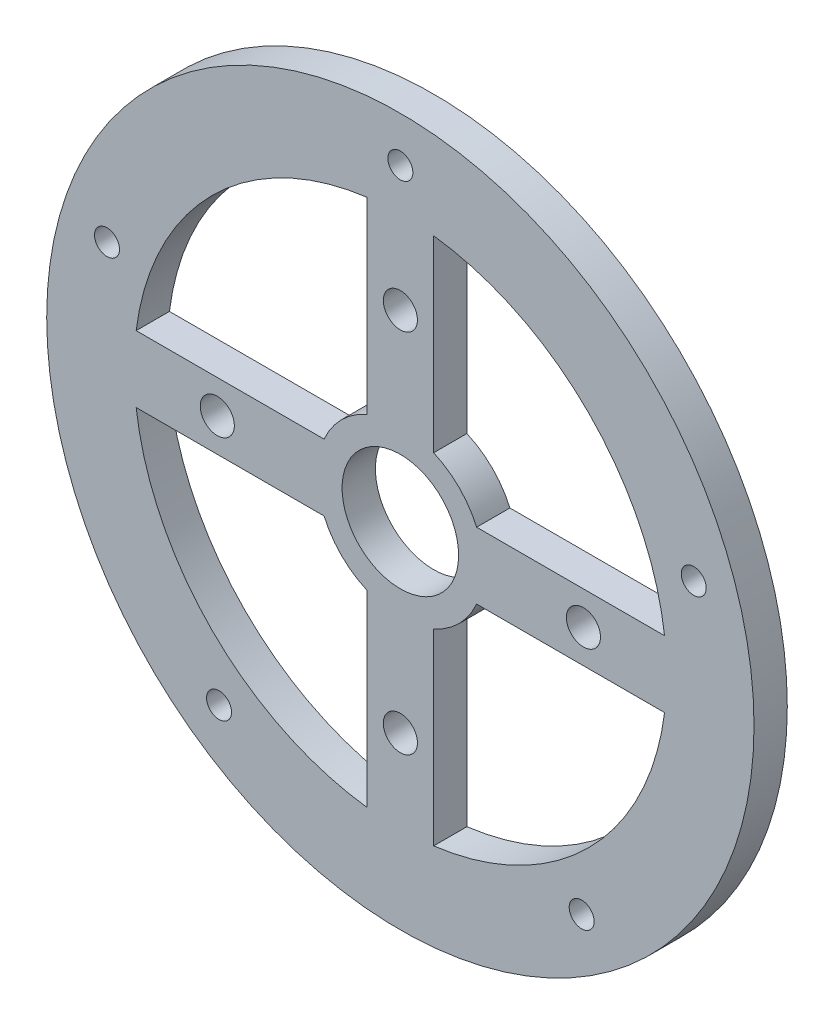
ISO-10303-21;
HEADER;
FILE_DESCRIPTION(('STEP AP214'),'2;1');
FILE_NAME('part.step','',(''),(''),'','','');
FILE_SCHEMA(('AUTOMOTIVE_DESIGN { 1 0 10303 214 1 1 1 1 }'));
ENDSEC;
DATA;
#1=APPLICATION_CONTEXT('core data for automotive mechanical design processes');
#2=APPLICATION_PROTOCOL_DEFINITION('international standard','automotive_design',2000,#1);
#3=PRODUCT_CONTEXT('',#1,'mechanical');
#4=PRODUCT('Part','Part','',(#3));
#5=PRODUCT_RELATED_PRODUCT_CATEGORY('part','',(#4));
#6=PRODUCT_DEFINITION_FORMATION('','',#4);
#7=PRODUCT_DEFINITION_CONTEXT('part definition',#1,'design');
#8=PRODUCT_DEFINITION('design','',#6,#7);
#9=PRODUCT_DEFINITION_SHAPE('','',#8);
#10=(LENGTH_UNIT() NAMED_UNIT(*) SI_UNIT(.MILLI.,.METRE.));
#11=(NAMED_UNIT(*) PLANE_ANGLE_UNIT() SI_UNIT($,.RADIAN.));
#12=(NAMED_UNIT(*) SI_UNIT($,.STERADIAN.) SOLID_ANGLE_UNIT());
#13=UNCERTAINTY_MEASURE_WITH_UNIT(LENGTH_MEASURE(1.E-05),#10,'distance_accuracy_value','');
#14=(GEOMETRIC_REPRESENTATION_CONTEXT(3) GLOBAL_UNCERTAINTY_ASSIGNED_CONTEXT((#13)) GLOBAL_UNIT_ASSIGNED_CONTEXT((#10,
#11,#12)) REPRESENTATION_CONTEXT('',''));
#15=CARTESIAN_POINT('',(0.,0.,0.));
#16=DIRECTION('',(0.,0.,1.));
#17=DIRECTION('',(1.,0.,0.));
#18=AXIS2_PLACEMENT_3D('',#15,#16,#17);
#19=CARTESIAN_POINT('',(0.,0.,4.));
#20=DIRECTION('',(0.,0.,-1.));
#21=DIRECTION('',(-1.,0.,0.));
#22=AXIS2_PLACEMENT_3D('',#19,#20,#21);
#23=CYLINDRICAL_SURFACE('',#22,32.);
#24=DIRECTION('',(0.,0.,1.));
#25=VECTOR('',#24,1.);
#26=CARTESIAN_POINT('',(-4.,-31.7490157327751,0.));
#27=LINE('',#26,#25);
#28=CARTESIAN_POINT('',(-4.,-31.7490157327751,0.));
#29=VERTEX_POINT('',#28);
#30=CARTESIAN_POINT('',(-4.,-31.7490157327751,4.));
#31=VERTEX_POINT('',#30);
#32=EDGE_CURVE('E261',#29,#31,#27,.T.);
#33=ORIENTED_EDGE('',*,*,#32,.F.);
#34=CARTESIAN_POINT('',(0.,0.,0.));
#35=DIRECTION('',(0.,0.,1.));
#36=DIRECTION('',(1.,0.,0.));
#37=AXIS2_PLACEMENT_3D('',#34,#35,#36);
#38=CIRCLE('',#37,32.);
#39=CARTESIAN_POINT('',(-31.7490157327751,-4.,0.));
#40=VERTEX_POINT('',#39);
#41=EDGE_CURVE('E335',#40,#29,#38,.T.);
#42=ORIENTED_EDGE('',*,*,#41,.F.);
#43=DIRECTION('',(0.,0.,1.));
#44=VECTOR('',#43,1.);
#45=CARTESIAN_POINT('',(-31.7490157327751,-4.,0.));
#46=LINE('',#45,#44);
#47=CARTESIAN_POINT('',(-31.7490157327751,-4.,4.));
#48=VERTEX_POINT('',#47);
#49=EDGE_CURVE('E269',#40,#48,#46,.T.);
#50=ORIENTED_EDGE('',*,*,#49,.T.);
#51=CARTESIAN_POINT('',(0.,0.,4.));
#52=DIRECTION('',(0.,0.,1.));
#53=DIRECTION('',(1.,0.,0.));
#54=AXIS2_PLACEMENT_3D('',#51,#52,#53);
#55=CIRCLE('',#54,32.);
#56=EDGE_CURVE('E333',#48,#31,#55,.T.);
#57=ORIENTED_EDGE('',*,*,#56,.T.);
#58=EDGE_LOOP('',(#33,#42,#50,#57));
#59=FACE_BOUND('',#58,.T.);
#60=ADVANCED_FACE('F33',(#59),#23,.F.);
#61=DIRECTION('',(0.,0.,1.));
#62=VECTOR('',#61,1.);
#63=CARTESIAN_POINT('',(-31.7490157327751,4.,0.));
#64=LINE('',#63,#62);
#65=CARTESIAN_POINT('',(-31.7490157327751,4.,0.));
#66=VERTEX_POINT('',#65);
#67=CARTESIAN_POINT('',(-31.7490157327751,4.,4.));
#68=VERTEX_POINT('',#67);
#69=EDGE_CURVE('E272',#66,#68,#64,.T.);
#70=ORIENTED_EDGE('',*,*,#69,.F.);
#71=CARTESIAN_POINT('',(-4.,31.7490157327751,0.));
#72=VERTEX_POINT('',#71);
#73=EDGE_CURVE('E330',#72,#66,#38,.T.);
#74=ORIENTED_EDGE('',*,*,#73,.F.);
#75=DIRECTION('',(0.,0.,1.));
#76=VECTOR('',#75,1.);
#77=CARTESIAN_POINT('',(-4.,31.7490157327751,0.));
#78=LINE('',#77,#76);
#79=CARTESIAN_POINT('',(-4.,31.7490157327751,4.));
#80=VERTEX_POINT('',#79);
#81=EDGE_CURVE('E279',#72,#80,#78,.T.);
#82=ORIENTED_EDGE('',*,*,#81,.T.);
#83=EDGE_CURVE('E326',#80,#68,#55,.T.);
#84=ORIENTED_EDGE('',*,*,#83,.T.);
#85=EDGE_LOOP('',(#70,#74,#82,#84));
#86=FACE_BOUND('',#85,.T.);
#87=ADVANCED_FACE('F355',(#86),#23,.F.);
#88=DIRECTION('',(0.,0.,1.));
#89=VECTOR('',#88,1.);
#90=CARTESIAN_POINT('',(4.,31.7490157327751,0.));
#91=LINE('',#90,#89);
#92=CARTESIAN_POINT('',(4.,31.7490157327751,0.));
#93=VERTEX_POINT('',#92);
#94=CARTESIAN_POINT('',(4.,31.7490157327751,4.));
#95=VERTEX_POINT('',#94);
#96=EDGE_CURVE('E282',#93,#95,#91,.T.);
#97=ORIENTED_EDGE('',*,*,#96,.F.);
#98=CARTESIAN_POINT('',(31.7490157327751,4.,0.));
#99=VERTEX_POINT('',#98);
#100=EDGE_CURVE('E328',#99,#93,#38,.T.);
#101=ORIENTED_EDGE('',*,*,#100,.F.);
#102=DIRECTION('',(0.,0.,1.));
#103=VECTOR('',#102,1.);
#104=CARTESIAN_POINT('',(31.7490157327751,4.,0.));
#105=LINE('',#104,#103);
#106=CARTESIAN_POINT('',(31.7490157327751,4.,4.));
#107=VERTEX_POINT('',#106);
#108=EDGE_CURVE('E289',#99,#107,#105,.T.);
#109=ORIENTED_EDGE('',*,*,#108,.T.);
#110=EDGE_CURVE('E324',#107,#95,#55,.T.);
#111=ORIENTED_EDGE('',*,*,#110,.T.);
#112=EDGE_LOOP('',(#97,#101,#109,#111));
#113=FACE_BOUND('',#112,.T.);
#114=ADVANCED_FACE('F389',(#113),#23,.F.);
#115=CARTESIAN_POINT('',(0.,0.,4.));
#116=DIRECTION('',(0.,0.,1.));
#117=DIRECTION('',(1.,0.,0.));
#118=AXIS2_PLACEMENT_3D('',#115,#116,#117);
#119=PLANE('',#118);
#120=DIRECTION('',(0.,1.,0.));
#121=VECTOR('',#120,1.);
#122=CARTESIAN_POINT('',(4.,0.,4.));
#123=LINE('',#122,#121);
#124=CARTESIAN_POINT('',(4.,9.16515138991168,4.));
#125=VERTEX_POINT('',#124);
#126=EDGE_CURVE('E226',#125,#95,#123,.T.);
#127=ORIENTED_EDGE('',*,*,#126,.T.);
#128=ORIENTED_EDGE('',*,*,#110,.F.);
#129=DIRECTION('',(1.,0.,0.));
#130=VECTOR('',#129,1.);
#131=CARTESIAN_POINT('',(0.,4.,4.));
#132=LINE('',#131,#130);
#133=CARTESIAN_POINT('',(9.16515138991168,4.,4.));
#134=VERTEX_POINT('',#133);
#135=EDGE_CURVE('E220',#134,#107,#132,.T.);
#136=ORIENTED_EDGE('',*,*,#135,.F.);
#137=CARTESIAN_POINT('',(0.,0.,4.));
#138=DIRECTION('',(0.,0.,1.));
#139=DIRECTION('',(1.,0.,0.));
#140=AXIS2_PLACEMENT_3D('',#137,#138,#139);
#141=CIRCLE('',#140,10.);
#142=EDGE_CURVE('E223',#134,#125,#141,.T.);
#143=ORIENTED_EDGE('',*,*,#142,.T.);
#144=EDGE_LOOP('',(#127,#128,#136,#143));
#145=FACE_BOUND('',#144,.T.);
#146=DIRECTION('',(-1.,0.,0.));
#147=VECTOR('',#146,1.);
#148=CARTESIAN_POINT('',(0.,4.,4.));
#149=LINE('',#148,#147);
#150=CARTESIAN_POINT('',(-9.16515138991168,4.,4.));
#151=VERTEX_POINT('',#150);
#152=EDGE_CURVE('E235',#151,#68,#149,.T.);
#153=ORIENTED_EDGE('',*,*,#152,.T.);
#154=ORIENTED_EDGE('',*,*,#83,.F.);
#155=DIRECTION('',(0.,1.,0.));
#156=VECTOR('',#155,1.);
#157=CARTESIAN_POINT('',(-4.,0.,4.));
#158=LINE('',#157,#156);
#159=CARTESIAN_POINT('',(-4.,9.16515138991168,4.));
#160=VERTEX_POINT('',#159);
#161=EDGE_CURVE('E229',#160,#80,#158,.T.);
#162=ORIENTED_EDGE('',*,*,#161,.F.);
#163=CARTESIAN_POINT('',(0.,0.,4.));
#164=DIRECTION('',(0.,0.,1.));
#165=DIRECTION('',(1.,0.,0.));
#166=AXIS2_PLACEMENT_3D('',#163,#164,#165);
#167=CIRCLE('',#166,10.);
#168=EDGE_CURVE('E232',#160,#151,#167,.T.);
#169=ORIENTED_EDGE('',*,*,#168,.T.);
#170=EDGE_LOOP('',(#153,#154,#162,#169));
#171=FACE_BOUND('',#170,.T.);
#172=DIRECTION('',(0.,-1.,0.));
#173=VECTOR('',#172,1.);
#174=CARTESIAN_POINT('',(-4.,0.,4.));
#175=LINE('',#174,#173);
#176=CARTESIAN_POINT('',(-4.,-9.16515138991168,4.));
#177=VERTEX_POINT('',#176);
#178=EDGE_CURVE('E244',#177,#31,#175,.T.);
#179=ORIENTED_EDGE('',*,*,#178,.T.);
#180=ORIENTED_EDGE('',*,*,#56,.F.);
#181=DIRECTION('',(-1.,0.,0.));
#182=VECTOR('',#181,1.);
#183=CARTESIAN_POINT('',(0.,-4.,4.));
#184=LINE('',#183,#182);
#185=CARTESIAN_POINT('',(-9.16515138991168,-4.,4.));
#186=VERTEX_POINT('',#185);
#187=EDGE_CURVE('E238',#186,#48,#184,.T.);
#188=ORIENTED_EDGE('',*,*,#187,.F.);
#189=CARTESIAN_POINT('',(0.,0.,4.));
#190=DIRECTION('',(0.,0.,1.));
#191=DIRECTION('',(1.,0.,0.));
#192=AXIS2_PLACEMENT_3D('',#189,#190,#191);
#193=CIRCLE('',#192,10.);
#194=EDGE_CURVE('E241',#186,#177,#193,.T.);
#195=ORIENTED_EDGE('',*,*,#194,.T.);
#196=EDGE_LOOP('',(#179,#180,#188,#195));
#197=FACE_BOUND('',#196,.T.);
#198=CARTESIAN_POINT('',(-21.7872378496499,-29.9875602732682,4.));
#199=DIRECTION('',(0.,0.,1.));
#200=DIRECTION('',(1.,0.,0.));
#201=AXIS2_PLACEMENT_3D('',#198,#199,#200);
#202=CIRCLE('',#201,1.5000000000033);
#203=CARTESIAN_POINT('',(-20.2872378496466,-29.9875602732682,4.));
#204=VERTEX_POINT('',#203);
#205=EDGE_CURVE('E301',#204,#204,#202,.T.);
#206=ORIENTED_EDGE('',*,*,#205,.F.);
#207=EDGE_LOOP('',(#206));
#208=FACE_BOUND('',#207,.T.);
#209=CARTESIAN_POINT('',(35.2524913617173,11.4542287847035,4.));
#210=DIRECTION('',(0.,0.,1.));
#211=DIRECTION('',(1.,0.,0.));
#212=AXIS2_PLACEMENT_3D('',#209,#210,#211);
#213=CIRCLE('',#212,1.50000000000071);
#214=CARTESIAN_POINT('',(36.752491361718,11.4542287847035,4.));
#215=VERTEX_POINT('',#214);
#216=EDGE_CURVE('E313',#215,#215,#213,.T.);
#217=ORIENTED_EDGE('',*,*,#216,.F.);
#218=EDGE_LOOP('',(#217));
#219=FACE_BOUND('',#218,.T.);
#220=CARTESIAN_POINT('',(4.,-31.7490157327751,4.));
#221=VERTEX_POINT('',#220);
#222=CARTESIAN_POINT('',(31.7490157327751,-4.,4.));
#223=VERTEX_POINT('',#222);
#224=EDGE_CURVE('E327',#221,#223,#55,.T.);
#225=ORIENTED_EDGE('',*,*,#224,.F.);
#226=DIRECTION('',(0.,-1.,0.));
#227=VECTOR('',#226,1.);
#228=CARTESIAN_POINT('',(4.,0.,4.));
#229=LINE('',#228,#227);
#230=CARTESIAN_POINT('',(4.,-9.16515138991168,4.));
#231=VERTEX_POINT('',#230);
#232=EDGE_CURVE('E214',#231,#221,#229,.T.);
#233=ORIENTED_EDGE('',*,*,#232,.F.);
#234=CARTESIAN_POINT('',(0.,0.,4.));
#235=DIRECTION('',(0.,0.,1.));
#236=DIRECTION('',(1.,0.,0.));
#237=AXIS2_PLACEMENT_3D('',#234,#235,#236);
#238=CIRCLE('',#237,10.);
#239=CARTESIAN_POINT('',(9.16515138991168,-4.,4.));
#240=VERTEX_POINT('',#239);
#241=EDGE_CURVE('E151',#231,#240,#238,.T.);
#242=ORIENTED_EDGE('',*,*,#241,.T.);
#243=DIRECTION('',(1.,0.,0.));
#244=VECTOR('',#243,1.);
#245=CARTESIAN_POINT('',(0.,-4.,4.));
#246=LINE('',#245,#244);
#247=EDGE_CURVE('E217',#240,#223,#246,.T.);
#248=ORIENTED_EDGE('',*,*,#247,.T.);
#249=EDGE_LOOP('',(#225,#233,#242,#248));
#250=FACE_BOUND('',#249,.T.);
#251=CARTESIAN_POINT('',(0.,0.,4.));
#252=DIRECTION('',(0.,0.,1.));
#253=DIRECTION('',(1.,0.,0.));
#254=AXIS2_PLACEMENT_3D('',#251,#252,#253);
#255=CIRCLE('',#254,42.5);
#256=CARTESIAN_POINT('',(42.5,0.,4.));
#257=VERTEX_POINT('',#256);
#258=EDGE_CURVE('E11',#257,#257,#255,.T.);
#259=ORIENTED_EDGE('',*,*,#258,.T.);
#260=EDGE_LOOP('',(#259));
#261=FACE_BOUND('',#260,.T.);
#262=CARTESIAN_POINT('',(0.,37.0666629771305,4.));
#263=DIRECTION('',(0.,0.,1.));
#264=DIRECTION('',(1.,0.,0.));
#265=AXIS2_PLACEMENT_3D('',#262,#263,#264);
#266=CIRCLE('',#265,1.5);
#267=CARTESIAN_POINT('',(1.5,37.0666629771305,4.));
#268=VERTEX_POINT('',#267);
#269=EDGE_CURVE('E319',#268,#268,#266,.T.);
#270=ORIENTED_EDGE('',*,*,#269,.F.);
#271=EDGE_LOOP('',(#270));
#272=FACE_BOUND('',#271,.T.);
#273=CARTESIAN_POINT('',(21.7872378496555,-29.9875602732663,4.));
#274=DIRECTION('',(0.,0.,1.));
#275=DIRECTION('',(1.,0.,0.));
#276=AXIS2_PLACEMENT_3D('',#273,#274,#275);
#277=CIRCLE('',#276,1.50000000000267);
#278=CARTESIAN_POINT('',(23.2872378496582,-29.9875602732663,4.));
#279=VERTEX_POINT('',#278);
#280=EDGE_CURVE('E307',#279,#279,#277,.T.);
#281=ORIENTED_EDGE('',*,*,#280,.F.);
#282=EDGE_LOOP('',(#281));
#283=FACE_BOUND('',#282,.T.);
#284=CARTESIAN_POINT('',(-35.2524913617152,11.4542287847005,4.));
#285=DIRECTION('',(0.,0.,1.));
#286=DIRECTION('',(1.,0.,0.));
#287=AXIS2_PLACEMENT_3D('',#284,#285,#286);
#288=CIRCLE('',#287,1.50000000000189);
#289=CARTESIAN_POINT('',(-33.7524913617133,11.4542287847005,4.));
#290=VERTEX_POINT('',#289);
#291=EDGE_CURVE('E295',#290,#290,#288,.T.);
#292=ORIENTED_EDGE('',*,*,#291,.F.);
#293=EDGE_LOOP('',(#292));
#294=FACE_BOUND('',#293,.T.);
#295=CARTESIAN_POINT('',(0.,-22.,4.));
#296=DIRECTION('',(0.,0.,1.));
#297=DIRECTION('',(1.,0.,0.));
#298=AXIS2_PLACEMENT_3D('',#295,#296,#297);
#299=CIRCLE('',#298,2.05000000000015);
#300=CARTESIAN_POINT('',(2.05000000000015,-22.,4.));
#301=VERTEX_POINT('',#300);
#302=EDGE_CURVE('E247',#301,#301,#299,.T.);
#303=ORIENTED_EDGE('',*,*,#302,.F.);
#304=EDGE_LOOP('',(#303));
#305=FACE_BOUND('',#304,.T.);
#306=CARTESIAN_POINT('',(0.,0.,4.));
#307=DIRECTION('',(0.,0.,1.));
#308=DIRECTION('',(1.,0.,0.));
#309=AXIS2_PLACEMENT_3D('',#306,#307,#308);
#310=CIRCLE('',#309,7.);
#311=CARTESIAN_POINT('',(7.,0.,4.));
#312=VERTEX_POINT('',#311);
#313=EDGE_CURVE('E250',#312,#312,#310,.T.);
#314=ORIENTED_EDGE('',*,*,#313,.F.);
#315=EDGE_LOOP('',(#314));
#316=FACE_BOUND('',#315,.T.);
#317=CARTESIAN_POINT('',(-22.,0.,4.));
#318=DIRECTION('',(0.,0.,1.));
#319=DIRECTION('',(1.,0.,0.));
#320=AXIS2_PLACEMENT_3D('',#317,#318,#319);
#321=CIRCLE('',#320,2.05000000000022);
#322=CARTESIAN_POINT('',(-19.9499999999998,0.,4.));
#323=VERTEX_POINT('',#322);
#324=EDGE_CURVE('E253',#323,#323,#321,.T.);
#325=ORIENTED_EDGE('',*,*,#324,.F.);
#326=EDGE_LOOP('',(#325));
#327=FACE_BOUND('',#326,.T.);
#328=CARTESIAN_POINT('',(22.,0.,4.));
#329=DIRECTION('',(0.,0.,1.));
#330=DIRECTION('',(1.,0.,0.));
#331=AXIS2_PLACEMENT_3D('',#328,#329,#330);
#332=CIRCLE('',#331,2.05000000000007);
#333=CARTESIAN_POINT('',(24.0500000000001,0.,4.));
#334=VERTEX_POINT('',#333);
#335=EDGE_CURVE('E256',#334,#334,#332,.T.);
#336=ORIENTED_EDGE('',*,*,#335,.F.);
#337=EDGE_LOOP('',(#336));
#338=FACE_BOUND('',#337,.T.);
#339=CARTESIAN_POINT('',(0.,22.,4.));
#340=DIRECTION('',(0.,0.,1.));
#341=DIRECTION('',(1.,0.,0.));
#342=AXIS2_PLACEMENT_3D('',#339,#340,#341);
#343=CIRCLE('',#342,2.05);
#344=CARTESIAN_POINT('',(2.05,22.,4.));
#345=VERTEX_POINT('',#344);
#346=EDGE_CURVE('E162',#345,#345,#343,.T.);
#347=ORIENTED_EDGE('',*,*,#346,.F.);
#348=EDGE_LOOP('',(#347));
#349=FACE_BOUND('',#348,.T.);
#350=ADVANCED_FACE('F363',(#145,#171,#197,#208,#219,#250,#261,#272,#283,#294,#305,#316,#327,
#338,#349),#119,.T.);
#351=CARTESIAN_POINT('',(0.,0.,0.));
#352=DIRECTION('',(0.,0.,1.));
#353=DIRECTION('',(1.,0.,0.));
#354=AXIS2_PLACEMENT_3D('',#351,#352,#353);
#355=PLANE('',#354);
#356=ORIENTED_EDGE('',*,*,#100,.T.);
#357=DIRECTION('',(0.,1.,0.));
#358=VECTOR('',#357,1.);
#359=CARTESIAN_POINT('',(4.,0.,0.));
#360=LINE('',#359,#358);
#361=CARTESIAN_POINT('',(4.,9.16515138991168,0.));
#362=VERTEX_POINT('',#361);
#363=EDGE_CURVE('E178',#362,#93,#360,.T.);
#364=ORIENTED_EDGE('',*,*,#363,.F.);
#365=CARTESIAN_POINT('',(0.,0.,0.));
#366=DIRECTION('',(0.,0.,1.));
#367=DIRECTION('',(1.,0.,0.));
#368=AXIS2_PLACEMENT_3D('',#365,#366,#367);
#369=CIRCLE('',#368,10.);
#370=CARTESIAN_POINT('',(9.16515138991168,4.,0.));
#371=VERTEX_POINT('',#370);
#372=EDGE_CURVE('E175',#371,#362,#369,.T.);
#373=ORIENTED_EDGE('',*,*,#372,.F.);
#374=DIRECTION('',(1.,0.,0.));
#375=VECTOR('',#374,1.);
#376=CARTESIAN_POINT('',(0.,4.,0.));
#377=LINE('',#376,#375);
#378=EDGE_CURVE('E170',#371,#99,#377,.T.);
#379=ORIENTED_EDGE('',*,*,#378,.T.);
#380=EDGE_LOOP('',(#356,#364,#373,#379));
#381=FACE_BOUND('',#380,.T.);
#382=ORIENTED_EDGE('',*,*,#73,.T.);
#383=DIRECTION('',(-1.,0.,0.));
#384=VECTOR('',#383,1.);
#385=CARTESIAN_POINT('',(0.,4.,0.));
#386=LINE('',#385,#384);
#387=CARTESIAN_POINT('',(-9.16515138991168,4.,0.));
#388=VERTEX_POINT('',#387);
#389=EDGE_CURVE('E187',#388,#66,#386,.T.);
#390=ORIENTED_EDGE('',*,*,#389,.F.);
#391=CARTESIAN_POINT('',(0.,0.,0.));
#392=DIRECTION('',(0.,0.,1.));
#393=DIRECTION('',(1.,0.,0.));
#394=AXIS2_PLACEMENT_3D('',#391,#392,#393);
#395=CIRCLE('',#394,10.);
#396=CARTESIAN_POINT('',(-4.,9.16515138991168,0.));
#397=VERTEX_POINT('',#396);
#398=EDGE_CURVE('E184',#397,#388,#395,.T.);
#399=ORIENTED_EDGE('',*,*,#398,.F.);
#400=DIRECTION('',(0.,1.,0.));
#401=VECTOR('',#400,1.);
#402=CARTESIAN_POINT('',(-4.,0.,0.));
#403=LINE('',#402,#401);
#404=EDGE_CURVE('E181',#397,#72,#403,.T.);
#405=ORIENTED_EDGE('',*,*,#404,.T.);
#406=EDGE_LOOP('',(#382,#390,#399,#405));
#407=FACE_BOUND('',#406,.T.);
#408=ORIENTED_EDGE('',*,*,#41,.T.);
#409=DIRECTION('',(0.,-1.,0.));
#410=VECTOR('',#409,1.);
#411=CARTESIAN_POINT('',(-4.,0.,0.));
#412=LINE('',#411,#410);
#413=CARTESIAN_POINT('',(-4.,-9.16515138991168,0.));
#414=VERTEX_POINT('',#413);
#415=EDGE_CURVE('E196',#414,#29,#412,.T.);
#416=ORIENTED_EDGE('',*,*,#415,.F.);
#417=CARTESIAN_POINT('',(0.,0.,0.));
#418=DIRECTION('',(0.,0.,1.));
#419=DIRECTION('',(1.,0.,0.));
#420=AXIS2_PLACEMENT_3D('',#417,#418,#419);
#421=CIRCLE('',#420,10.);
#422=CARTESIAN_POINT('',(-9.16515138991168,-4.,0.));
#423=VERTEX_POINT('',#422);
#424=EDGE_CURVE('E193',#423,#414,#421,.T.);
#425=ORIENTED_EDGE('',*,*,#424,.F.);
#426=DIRECTION('',(-1.,0.,0.));
#427=VECTOR('',#426,1.);
#428=CARTESIAN_POINT('',(0.,-4.,0.));
#429=LINE('',#428,#427);
#430=EDGE_CURVE('E190',#423,#40,#429,.T.);
#431=ORIENTED_EDGE('',*,*,#430,.T.);
#432=EDGE_LOOP('',(#408,#416,#425,#431));
#433=FACE_BOUND('',#432,.T.);
#434=CARTESIAN_POINT('',(0.,0.,0.));
#435=DIRECTION('',(0.,0.,1.));
#436=DIRECTION('',(1.,0.,0.));
#437=AXIS2_PLACEMENT_3D('',#434,#435,#436);
#438=CIRCLE('',#437,42.5);
#439=CARTESIAN_POINT('',(42.5,0.,0.));
#440=VERTEX_POINT('',#439);
#441=EDGE_CURVE('E37',#440,#440,#438,.T.);
#442=ORIENTED_EDGE('',*,*,#441,.F.);
#443=EDGE_LOOP('',(#442));
#444=FACE_BOUND('',#443,.T.);
#445=DIRECTION('',(0.,-1.,0.));
#446=VECTOR('',#445,1.);
#447=CARTESIAN_POINT('',(4.,0.,0.));
#448=LINE('',#447,#446);
#449=CARTESIAN_POINT('',(4.,-9.16515138991168,0.));
#450=VERTEX_POINT('',#449);
#451=CARTESIAN_POINT('',(4.,-31.7490157327751,0.));
#452=VERTEX_POINT('',#451);
#453=EDGE_CURVE('E159',#450,#452,#448,.T.);
#454=ORIENTED_EDGE('',*,*,#453,.T.);
#455=CARTESIAN_POINT('',(31.7490157327751,-4.,0.));
#456=VERTEX_POINT('',#455);
#457=EDGE_CURVE('E52',#452,#456,#38,.T.);
#458=ORIENTED_EDGE('',*,*,#457,.T.);
#459=DIRECTION('',(1.,0.,0.));
#460=VECTOR('',#459,1.);
#461=CARTESIAN_POINT('',(0.,-4.,0.));
#462=LINE('',#461,#460);
#463=CARTESIAN_POINT('',(9.16515138991168,-4.,0.));
#464=VERTEX_POINT('',#463);
#465=EDGE_CURVE('E168',#464,#456,#462,.T.);
#466=ORIENTED_EDGE('',*,*,#465,.F.);
#467=CARTESIAN_POINT('',(0.,0.,0.));
#468=DIRECTION('',(0.,0.,1.));
#469=DIRECTION('',(1.,0.,0.));
#470=AXIS2_PLACEMENT_3D('',#467,#468,#469);
#471=CIRCLE('',#470,10.);
#472=EDGE_CURVE('E149',#450,#464,#471,.T.);
#473=ORIENTED_EDGE('',*,*,#472,.F.);
#474=EDGE_LOOP('',(#454,#458,#466,#473));
#475=FACE_BOUND('',#474,.T.);
#476=CARTESIAN_POINT('',(0.,37.0666629771305,0.));
#477=DIRECTION('',(0.,0.,1.));
#478=DIRECTION('',(1.,0.,0.));
#479=AXIS2_PLACEMENT_3D('',#476,#477,#478);
#480=CIRCLE('',#479,1.5);
#481=CARTESIAN_POINT('',(1.5,37.0666629771305,0.));
#482=VERTEX_POINT('',#481);
#483=EDGE_CURVE('E316',#482,#482,#480,.T.);
#484=ORIENTED_EDGE('',*,*,#483,.T.);
#485=EDGE_LOOP('',(#484));
#486=FACE_BOUND('',#485,.T.);
#487=CARTESIAN_POINT('',(35.2524913617173,11.4542287847035,0.));
#488=DIRECTION('',(0.,0.,1.));
#489=DIRECTION('',(1.,0.,0.));
#490=AXIS2_PLACEMENT_3D('',#487,#488,#489);
#491=CIRCLE('',#490,1.50000000000071);
#492=CARTESIAN_POINT('',(36.752491361718,11.4542287847035,0.));
#493=VERTEX_POINT('',#492);
#494=EDGE_CURVE('E310',#493,#493,#491,.T.);
#495=ORIENTED_EDGE('',*,*,#494,.T.);
#496=EDGE_LOOP('',(#495));
#497=FACE_BOUND('',#496,.T.);
#498=CARTESIAN_POINT('',(21.7872378496555,-29.9875602732663,0.));
#499=DIRECTION('',(0.,0.,1.));
#500=DIRECTION('',(1.,0.,0.));
#501=AXIS2_PLACEMENT_3D('',#498,#499,#500);
#502=CIRCLE('',#501,1.50000000000267);
#503=CARTESIAN_POINT('',(23.2872378496582,-29.9875602732663,0.));
#504=VERTEX_POINT('',#503);
#505=EDGE_CURVE('E304',#504,#504,#502,.T.);
#506=ORIENTED_EDGE('',*,*,#505,.T.);
#507=EDGE_LOOP('',(#506));
#508=FACE_BOUND('',#507,.T.);
#509=CARTESIAN_POINT('',(-21.7872378496499,-29.9875602732682,0.));
#510=DIRECTION('',(0.,0.,1.));
#511=DIRECTION('',(1.,0.,0.));
#512=AXIS2_PLACEMENT_3D('',#509,#510,#511);
#513=CIRCLE('',#512,1.5000000000033);
#514=CARTESIAN_POINT('',(-20.2872378496466,-29.9875602732682,0.));
#515=VERTEX_POINT('',#514);
#516=EDGE_CURVE('E298',#515,#515,#513,.T.);
#517=ORIENTED_EDGE('',*,*,#516,.T.);
#518=EDGE_LOOP('',(#517));
#519=FACE_BOUND('',#518,.T.);
#520=CARTESIAN_POINT('',(-35.2524913617152,11.4542287847005,0.));
#521=DIRECTION('',(0.,0.,1.));
#522=DIRECTION('',(1.,0.,0.));
#523=AXIS2_PLACEMENT_3D('',#520,#521,#522);
#524=CIRCLE('',#523,1.50000000000189);
#525=CARTESIAN_POINT('',(-33.7524913617133,11.4542287847005,0.));
#526=VERTEX_POINT('',#525);
#527=EDGE_CURVE('E264',#526,#526,#524,.T.);
#528=ORIENTED_EDGE('',*,*,#527,.T.);
#529=EDGE_LOOP('',(#528));
#530=FACE_BOUND('',#529,.T.);
#531=CARTESIAN_POINT('',(0.,-22.,0.));
#532=DIRECTION('',(0.,0.,1.));
#533=DIRECTION('',(1.,0.,0.));
#534=AXIS2_PLACEMENT_3D('',#531,#532,#533);
#535=CIRCLE('',#534,2.05000000000015);
#536=CARTESIAN_POINT('',(2.05000000000015,-22.,0.));
#537=VERTEX_POINT('',#536);
#538=EDGE_CURVE('E199',#537,#537,#535,.T.);
#539=ORIENTED_EDGE('',*,*,#538,.T.);
#540=EDGE_LOOP('',(#539));
#541=FACE_BOUND('',#540,.T.);
#542=CARTESIAN_POINT('',(0.,0.,0.));
#543=DIRECTION('',(0.,0.,1.));
#544=DIRECTION('',(1.,0.,0.));
#545=AXIS2_PLACEMENT_3D('',#542,#543,#544);
#546=CIRCLE('',#545,7.);
#547=CARTESIAN_POINT('',(7.,0.,0.));
#548=VERTEX_POINT('',#547);
#549=EDGE_CURVE('E202',#548,#548,#546,.T.);
#550=ORIENTED_EDGE('',*,*,#549,.T.);
#551=EDGE_LOOP('',(#550));
#552=FACE_BOUND('',#551,.T.);
#553=CARTESIAN_POINT('',(-22.,0.,0.));
#554=DIRECTION('',(0.,0.,1.));
#555=DIRECTION('',(1.,0.,0.));
#556=AXIS2_PLACEMENT_3D('',#553,#554,#555);
#557=CIRCLE('',#556,2.05000000000022);
#558=CARTESIAN_POINT('',(-19.9499999999998,0.,0.));
#559=VERTEX_POINT('',#558);
#560=EDGE_CURVE('E205',#559,#559,#557,.T.);
#561=ORIENTED_EDGE('',*,*,#560,.T.);
#562=EDGE_LOOP('',(#561));
#563=FACE_BOUND('',#562,.T.);
#564=CARTESIAN_POINT('',(22.,0.,0.));
#565=DIRECTION('',(0.,0.,1.));
#566=DIRECTION('',(1.,0.,0.));
#567=AXIS2_PLACEMENT_3D('',#564,#565,#566);
#568=CIRCLE('',#567,2.05000000000007);
#569=CARTESIAN_POINT('',(24.0500000000001,0.,0.));
#570=VERTEX_POINT('',#569);
#571=EDGE_CURVE('E208',#570,#570,#568,.T.);
#572=ORIENTED_EDGE('',*,*,#571,.T.);
#573=EDGE_LOOP('',(#572));
#574=FACE_BOUND('',#573,.T.);
#575=CARTESIAN_POINT('',(0.,22.,0.));
#576=DIRECTION('',(0.,0.,1.));
#577=DIRECTION('',(1.,0.,0.));
#578=AXIS2_PLACEMENT_3D('',#575,#576,#577);
#579=CIRCLE('',#578,2.05);
#580=CARTESIAN_POINT('',(2.05,22.,0.));
#581=VERTEX_POINT('',#580);
#582=EDGE_CURVE('E211',#581,#581,#579,.T.);
#583=ORIENTED_EDGE('',*,*,#582,.T.);
#584=EDGE_LOOP('',(#583));
#585=FACE_BOUND('',#584,.T.);
#586=ADVANCED_FACE('F165',(#381,#407,#433,#444,#475,#486,#497,#508,#519,#530,#541,#552,#563,
#574,#585),#355,.F.);
#587=CARTESIAN_POINT('',(0.,0.,4.));
#588=DIRECTION('',(0.,0.,-1.));
#589=DIRECTION('',(-1.,0.,0.));
#590=AXIS2_PLACEMENT_3D('',#587,#588,#589);
#591=CYLINDRICAL_SURFACE('',#590,42.5);
#592=ORIENTED_EDGE('',*,*,#258,.F.);
#593=EDGE_LOOP('',(#592));
#594=FACE_BOUND('',#593,.T.);
#595=ORIENTED_EDGE('',*,*,#441,.T.);
#596=EDGE_LOOP('',(#595));
#597=FACE_BOUND('',#596,.T.);
#598=ADVANCED_FACE('F35',(#594,#597),#591,.T.);
#599=DIRECTION('',(0.,0.,1.));
#600=VECTOR('',#599,1.);
#601=CARTESIAN_POINT('',(31.7490157327751,-4.,0.));
#602=LINE('',#601,#600);
#603=EDGE_CURVE('E48',#456,#223,#602,.T.);
#604=ORIENTED_EDGE('',*,*,#603,.F.);
#605=ORIENTED_EDGE('',*,*,#457,.F.);
#606=DIRECTION('',(0.,0.,1.));
#607=VECTOR('',#606,1.);
#608=CARTESIAN_POINT('',(4.,-31.7490157327751,0.));
#609=LINE('',#608,#607);
#610=EDGE_CURVE('E156',#452,#221,#609,.T.);
#611=ORIENTED_EDGE('',*,*,#610,.T.);
#612=ORIENTED_EDGE('',*,*,#224,.T.);
#613=EDGE_LOOP('',(#604,#605,#611,#612));
#614=FACE_BOUND('',#613,.T.);
#615=ADVANCED_FACE('F385',(#614),#23,.F.);
#616=CARTESIAN_POINT('',(0.,37.0666629771305,4.));
#617=DIRECTION('',(0.,0.,-1.));
#618=DIRECTION('',(-1.,0.,0.));
#619=AXIS2_PLACEMENT_3D('',#616,#617,#618);
#620=CYLINDRICAL_SURFACE('',#619,1.5);
#621=ORIENTED_EDGE('',*,*,#269,.T.);
#622=EDGE_LOOP('',(#621));
#623=FACE_BOUND('',#622,.T.);
#624=ORIENTED_EDGE('',*,*,#483,.F.);
#625=EDGE_LOOP('',(#624));
#626=FACE_BOUND('',#625,.T.);
#627=ADVANCED_FACE('F393',(#623,#626),#620,.F.);
#628=CARTESIAN_POINT('',(35.2524913617173,11.4542287847035,4.));
#629=DIRECTION('',(0.,0.,-1.));
#630=DIRECTION('',(-1.,0.,0.));
#631=AXIS2_PLACEMENT_3D('',#628,#629,#630);
#632=CYLINDRICAL_SURFACE('',#631,1.50000000000071);
#633=ORIENTED_EDGE('',*,*,#216,.T.);
#634=EDGE_LOOP('',(#633));
#635=FACE_BOUND('',#634,.T.);
#636=ORIENTED_EDGE('',*,*,#494,.F.);
#637=EDGE_LOOP('',(#636));
#638=FACE_BOUND('',#637,.T.);
#639=ADVANCED_FACE('F398',(#635,#638),#632,.F.);
#640=CARTESIAN_POINT('',(21.7872378496555,-29.9875602732663,4.));
#641=DIRECTION('',(0.,0.,-1.));
#642=DIRECTION('',(-1.,0.,0.));
#643=AXIS2_PLACEMENT_3D('',#640,#641,#642);
#644=CYLINDRICAL_SURFACE('',#643,1.50000000000267);
#645=ORIENTED_EDGE('',*,*,#280,.T.);
#646=EDGE_LOOP('',(#645));
#647=FACE_BOUND('',#646,.T.);
#648=ORIENTED_EDGE('',*,*,#505,.F.);
#649=EDGE_LOOP('',(#648));
#650=FACE_BOUND('',#649,.T.);
#651=ADVANCED_FACE('F441',(#647,#650),#644,.F.);
#652=CARTESIAN_POINT('',(-21.7872378496499,-29.9875602732682,4.));
#653=DIRECTION('',(0.,0.,-1.));
#654=DIRECTION('',(-1.,0.,0.));
#655=AXIS2_PLACEMENT_3D('',#652,#653,#654);
#656=CYLINDRICAL_SURFACE('',#655,1.5000000000033);
#657=ORIENTED_EDGE('',*,*,#205,.T.);
#658=EDGE_LOOP('',(#657));
#659=FACE_BOUND('',#658,.T.);
#660=ORIENTED_EDGE('',*,*,#516,.F.);
#661=EDGE_LOOP('',(#660));
#662=FACE_BOUND('',#661,.T.);
#663=ADVANCED_FACE('F437',(#659,#662),#656,.F.);
#664=CARTESIAN_POINT('',(-35.2524913617152,11.4542287847005,4.));
#665=DIRECTION('',(0.,0.,-1.));
#666=DIRECTION('',(-1.,0.,0.));
#667=AXIS2_PLACEMENT_3D('',#664,#665,#666);
#668=CYLINDRICAL_SURFACE('',#667,1.50000000000189);
#669=ORIENTED_EDGE('',*,*,#291,.T.);
#670=EDGE_LOOP('',(#669));
#671=FACE_BOUND('',#670,.T.);
#672=ORIENTED_EDGE('',*,*,#527,.F.);
#673=EDGE_LOOP('',(#672));
#674=FACE_BOUND('',#673,.T.);
#675=ADVANCED_FACE('F434',(#671,#674),#668,.F.);
#676=CARTESIAN_POINT('',(-4.,0.,0.));
#677=DIRECTION('',(-1.,0.,0.));
#678=DIRECTION('',(0.,0.,1.));
#679=AXIS2_PLACEMENT_3D('',#676,#677,#678);
#680=PLANE('',#679);
#681=ORIENTED_EDGE('',*,*,#178,.F.);
#682=DIRECTION('',(0.,0.,1.));
#683=VECTOR('',#682,1.);
#684=CARTESIAN_POINT('',(-4.,-9.16515138991168,0.));
#685=LINE('',#684,#683);
#686=EDGE_CURVE('E265',#414,#177,#685,.T.);
#687=ORIENTED_EDGE('',*,*,#686,.F.);
#688=ORIENTED_EDGE('',*,*,#415,.T.);
#689=ORIENTED_EDGE('',*,*,#32,.T.);
#690=EDGE_LOOP('',(#681,#687,#688,#689));
#691=FACE_BOUND('',#690,.T.);
#692=ADVANCED_FACE('F346',(#691),#680,.T.);
#693=CARTESIAN_POINT('',(0.,0.,0.));
#694=DIRECTION('',(0.,0.,1.));
#695=DIRECTION('',(1.,0.,0.));
#696=AXIS2_PLACEMENT_3D('',#693,#694,#695);
#697=CYLINDRICAL_SURFACE('',#696,10.);
#698=ORIENTED_EDGE('',*,*,#194,.F.);
#699=DIRECTION('',(0.,0.,1.));
#700=VECTOR('',#699,1.);
#701=CARTESIAN_POINT('',(-9.16515138991168,-4.,0.));
#702=LINE('',#701,#700);
#703=EDGE_CURVE('E267',#423,#186,#702,.T.);
#704=ORIENTED_EDGE('',*,*,#703,.F.);
#705=ORIENTED_EDGE('',*,*,#424,.T.);
#706=ORIENTED_EDGE('',*,*,#686,.T.);
#707=EDGE_LOOP('',(#698,#704,#705,#706));
#708=FACE_BOUND('',#707,.T.);
#709=ADVANCED_FACE('F349',(#708),#697,.T.);
#710=CARTESIAN_POINT('',(0.,-4.,0.));
#711=DIRECTION('',(0.,1.,0.));
#712=DIRECTION('',(0.,0.,1.));
#713=AXIS2_PLACEMENT_3D('',#710,#711,#712);
#714=PLANE('',#713);
#715=ORIENTED_EDGE('',*,*,#187,.T.);
#716=ORIENTED_EDGE('',*,*,#49,.F.);
#717=ORIENTED_EDGE('',*,*,#430,.F.);
#718=ORIENTED_EDGE('',*,*,#703,.T.);
#719=EDGE_LOOP('',(#715,#716,#717,#718));
#720=FACE_BOUND('',#719,.T.);
#721=ADVANCED_FACE('F352',(#720),#714,.F.);
#722=CARTESIAN_POINT('',(0.,4.,0.));
#723=DIRECTION('',(0.,1.,0.));
#724=DIRECTION('',(0.,0.,1.));
#725=AXIS2_PLACEMENT_3D('',#722,#723,#724);
#726=PLANE('',#725);
#727=ORIENTED_EDGE('',*,*,#152,.F.);
#728=DIRECTION('',(0.,0.,1.));
#729=VECTOR('',#728,1.);
#730=CARTESIAN_POINT('',(-9.16515138991168,4.,0.));
#731=LINE('',#730,#729);
#732=EDGE_CURVE('E275',#388,#151,#731,.T.);
#733=ORIENTED_EDGE('',*,*,#732,.F.);
#734=ORIENTED_EDGE('',*,*,#389,.T.);
#735=ORIENTED_EDGE('',*,*,#69,.T.);
#736=EDGE_LOOP('',(#727,#733,#734,#735));
#737=FACE_BOUND('',#736,.T.);
#738=ADVANCED_FACE('F361',(#737),#726,.T.);
#739=CARTESIAN_POINT('',(0.,0.,0.));
#740=DIRECTION('',(0.,0.,1.));
#741=DIRECTION('',(1.,0.,0.));
#742=AXIS2_PLACEMENT_3D('',#739,#740,#741);
#743=CYLINDRICAL_SURFACE('',#742,10.);
#744=ORIENTED_EDGE('',*,*,#168,.F.);
#745=DIRECTION('',(0.,0.,1.));
#746=VECTOR('',#745,1.);
#747=CARTESIAN_POINT('',(-4.,9.16515138991168,0.));
#748=LINE('',#747,#746);
#749=EDGE_CURVE('E277',#397,#160,#748,.T.);
#750=ORIENTED_EDGE('',*,*,#749,.F.);
#751=ORIENTED_EDGE('',*,*,#398,.T.);
#752=ORIENTED_EDGE('',*,*,#732,.T.);
#753=EDGE_LOOP('',(#744,#750,#751,#752));
#754=FACE_BOUND('',#753,.T.);
#755=ADVANCED_FACE('F366',(#754),#743,.T.);
#756=CARTESIAN_POINT('',(-4.,0.,0.));
#757=DIRECTION('',(1.,0.,0.));
#758=DIRECTION('',(0.,0.,-1.));
#759=AXIS2_PLACEMENT_3D('',#756,#757,#758);
#760=PLANE('',#759);
#761=ORIENTED_EDGE('',*,*,#161,.T.);
#762=ORIENTED_EDGE('',*,*,#81,.F.);
#763=ORIENTED_EDGE('',*,*,#404,.F.);
#764=ORIENTED_EDGE('',*,*,#749,.T.);
#765=EDGE_LOOP('',(#761,#762,#763,#764));
#766=FACE_BOUND('',#765,.T.);
#767=ADVANCED_FACE('F371',(#766),#760,.F.);
#768=CARTESIAN_POINT('',(4.,0.,0.));
#769=DIRECTION('',(1.,0.,0.));
#770=DIRECTION('',(0.,0.,-1.));
#771=AXIS2_PLACEMENT_3D('',#768,#769,#770);
#772=PLANE('',#771);
#773=ORIENTED_EDGE('',*,*,#126,.F.);
#774=DIRECTION('',(0.,0.,1.));
#775=VECTOR('',#774,1.);
#776=CARTESIAN_POINT('',(4.,9.16515138991168,0.));
#777=LINE('',#776,#775);
#778=EDGE_CURVE('E285',#362,#125,#777,.T.);
#779=ORIENTED_EDGE('',*,*,#778,.F.);
#780=ORIENTED_EDGE('',*,*,#363,.T.);
#781=ORIENTED_EDGE('',*,*,#96,.T.);
#782=EDGE_LOOP('',(#773,#779,#780,#781));
#783=FACE_BOUND('',#782,.T.);
#784=ADVANCED_FACE('F373',(#783),#772,.T.);
#785=CARTESIAN_POINT('',(0.,0.,0.));
#786=DIRECTION('',(0.,0.,1.));
#787=DIRECTION('',(1.,0.,0.));
#788=AXIS2_PLACEMENT_3D('',#785,#786,#787);
#789=CYLINDRICAL_SURFACE('',#788,10.);
#790=ORIENTED_EDGE('',*,*,#142,.F.);
#791=DIRECTION('',(0.,0.,1.));
#792=VECTOR('',#791,1.);
#793=CARTESIAN_POINT('',(9.16515138991168,4.,0.));
#794=LINE('',#793,#792);
#795=EDGE_CURVE('E287',#371,#134,#794,.T.);
#796=ORIENTED_EDGE('',*,*,#795,.F.);
#797=ORIENTED_EDGE('',*,*,#372,.T.);
#798=ORIENTED_EDGE('',*,*,#778,.T.);
#799=EDGE_LOOP('',(#790,#796,#797,#798));
#800=FACE_BOUND('',#799,.T.);
#801=ADVANCED_FACE('F379',(#800),#789,.T.);
#802=CARTESIAN_POINT('',(0.,4.,0.));
#803=DIRECTION('',(0.,-1.,0.));
#804=DIRECTION('',(0.,0.,-1.));
#805=AXIS2_PLACEMENT_3D('',#802,#803,#804);
#806=PLANE('',#805);
#807=ORIENTED_EDGE('',*,*,#135,.T.);
#808=ORIENTED_EDGE('',*,*,#108,.F.);
#809=ORIENTED_EDGE('',*,*,#378,.F.);
#810=ORIENTED_EDGE('',*,*,#795,.T.);
#811=EDGE_LOOP('',(#807,#808,#809,#810));
#812=FACE_BOUND('',#811,.T.);
#813=ADVANCED_FACE('F415',(#812),#806,.F.);
#814=CARTESIAN_POINT('',(0.,-4.,0.));
#815=DIRECTION('',(0.,-1.,0.));
#816=DIRECTION('',(0.,0.,-1.));
#817=AXIS2_PLACEMENT_3D('',#814,#815,#816);
#818=PLANE('',#817);
#819=ORIENTED_EDGE('',*,*,#247,.F.);
#820=DIRECTION('',(0.,0.,1.));
#821=VECTOR('',#820,1.);
#822=CARTESIAN_POINT('',(9.16515138991168,-4.,0.));
#823=LINE('',#822,#821);
#824=EDGE_CURVE('E155',#464,#240,#823,.T.);
#825=ORIENTED_EDGE('',*,*,#824,.F.);
#826=ORIENTED_EDGE('',*,*,#465,.T.);
#827=ORIENTED_EDGE('',*,*,#603,.T.);
#828=EDGE_LOOP('',(#819,#825,#826,#827));
#829=FACE_BOUND('',#828,.T.);
#830=ADVANCED_FACE('F417',(#829),#818,.T.);
#831=CARTESIAN_POINT('',(0.,0.,0.));
#832=DIRECTION('',(0.,0.,1.));
#833=DIRECTION('',(1.,0.,0.));
#834=AXIS2_PLACEMENT_3D('',#831,#832,#833);
#835=CYLINDRICAL_SURFACE('',#834,10.);
#836=ORIENTED_EDGE('',*,*,#241,.F.);
#837=DIRECTION('',(0.,0.,1.));
#838=VECTOR('',#837,1.);
#839=CARTESIAN_POINT('',(4.,-9.16515138991168,0.));
#840=LINE('',#839,#838);
#841=EDGE_CURVE('E145',#450,#231,#840,.T.);
#842=ORIENTED_EDGE('',*,*,#841,.F.);
#843=ORIENTED_EDGE('',*,*,#472,.T.);
#844=ORIENTED_EDGE('',*,*,#824,.T.);
#845=EDGE_LOOP('',(#836,#842,#843,#844));
#846=FACE_BOUND('',#845,.T.);
#847=ADVANCED_FACE('F147',(#846),#835,.T.);
#848=CARTESIAN_POINT('',(22.,0.,0.));
#849=DIRECTION('',(0.,0.,1.));
#850=DIRECTION('',(1.,0.,0.));
#851=AXIS2_PLACEMENT_3D('',#848,#849,#850);
#852=CYLINDRICAL_SURFACE('',#851,2.05000000000007);
#853=ORIENTED_EDGE('',*,*,#571,.F.);
#854=EDGE_LOOP('',(#853));
#855=FACE_BOUND('',#854,.T.);
#856=ORIENTED_EDGE('',*,*,#335,.T.);
#857=EDGE_LOOP('',(#856));
#858=FACE_BOUND('',#857,.T.);
#859=ADVANCED_FACE('F429',(#855,#858),#852,.F.);
#860=CARTESIAN_POINT('',(-22.,0.,0.));
#861=DIRECTION('',(0.,0.,1.));
#862=DIRECTION('',(1.,0.,0.));
#863=AXIS2_PLACEMENT_3D('',#860,#861,#862);
#864=CYLINDRICAL_SURFACE('',#863,2.05000000000022);
#865=ORIENTED_EDGE('',*,*,#560,.F.);
#866=EDGE_LOOP('',(#865));
#867=FACE_BOUND('',#866,.T.);
#868=ORIENTED_EDGE('',*,*,#324,.T.);
#869=EDGE_LOOP('',(#868));
#870=FACE_BOUND('',#869,.T.);
#871=ADVANCED_FACE('F482',(#867,#870),#864,.F.);
#872=CARTESIAN_POINT('',(0.,0.,0.));
#873=DIRECTION('',(0.,0.,1.));
#874=DIRECTION('',(1.,0.,0.));
#875=AXIS2_PLACEMENT_3D('',#872,#873,#874);
#876=CYLINDRICAL_SURFACE('',#875,7.);
#877=ORIENTED_EDGE('',*,*,#549,.F.);
#878=EDGE_LOOP('',(#877));
#879=FACE_BOUND('',#878,.T.);
#880=ORIENTED_EDGE('',*,*,#313,.T.);
#881=EDGE_LOOP('',(#880));
#882=FACE_BOUND('',#881,.T.);
#883=ADVANCED_FACE('F486',(#879,#882),#876,.F.);
#884=CARTESIAN_POINT('',(0.,-22.,0.));
#885=DIRECTION('',(0.,0.,1.));
#886=DIRECTION('',(1.,0.,0.));
#887=AXIS2_PLACEMENT_3D('',#884,#885,#886);
#888=CYLINDRICAL_SURFACE('',#887,2.05000000000015);
#889=ORIENTED_EDGE('',*,*,#538,.F.);
#890=EDGE_LOOP('',(#889));
#891=FACE_BOUND('',#890,.T.);
#892=ORIENTED_EDGE('',*,*,#302,.T.);
#893=EDGE_LOOP('',(#892));
#894=FACE_BOUND('',#893,.T.);
#895=ADVANCED_FACE('F433',(#891,#894),#888,.F.);
#896=CARTESIAN_POINT('',(4.,0.,0.));
#897=DIRECTION('',(-1.,0.,0.));
#898=DIRECTION('',(0.,0.,1.));
#899=AXIS2_PLACEMENT_3D('',#896,#897,#898);
#900=PLANE('',#899);
#901=ORIENTED_EDGE('',*,*,#232,.T.);
#902=ORIENTED_EDGE('',*,*,#610,.F.);
#903=ORIENTED_EDGE('',*,*,#453,.F.);
#904=ORIENTED_EDGE('',*,*,#841,.T.);
#905=EDGE_LOOP('',(#901,#902,#903,#904));
#906=FACE_BOUND('',#905,.T.);
#907=ADVANCED_FACE('F160',(#906),#900,.F.);
#908=CARTESIAN_POINT('',(0.,22.,0.));
#909=DIRECTION('',(0.,0.,1.));
#910=DIRECTION('',(1.,0.,0.));
#911=AXIS2_PLACEMENT_3D('',#908,#909,#910);
#912=CYLINDRICAL_SURFACE('',#911,2.05);
#913=ORIENTED_EDGE('',*,*,#582,.F.);
#914=EDGE_LOOP('',(#913));
#915=FACE_BOUND('',#914,.T.);
#916=ORIENTED_EDGE('',*,*,#346,.T.);
#917=EDGE_LOOP('',(#916));
#918=FACE_BOUND('',#917,.T.);
#919=ADVANCED_FACE('F432',(#915,#918),#912,.F.);
#920=CLOSED_SHELL('',(#60,#87,#114,#350,#586,#598,#615,#627,#639,#651,#663,#675,#692,#709,#721,
#738,#755,#767,#784,#801,#813,#830,#847,#859,#871,#883,#895,#907,#919));
#921=MANIFOLD_SOLID_BREP('B2',#920);
#922=ADVANCED_BREP_SHAPE_REPRESENTATION('',(#18,#921),#14);
#923=SHAPE_DEFINITION_REPRESENTATION(#9,#922);
ENDSEC;
END-ISO-10303-21;
